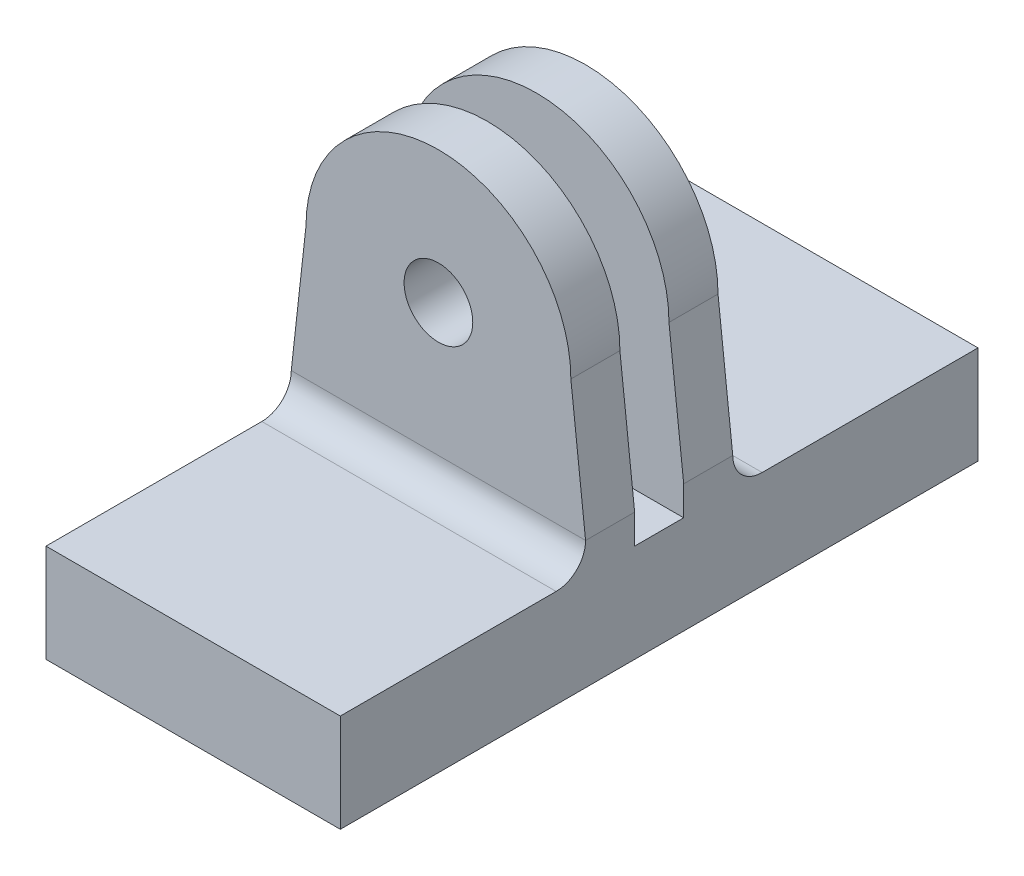
ISO-10303-21;
HEADER;
FILE_DESCRIPTION(('STEP AP214'),'2;1');
FILE_NAME('part.step','',(''),(''),'','','');
FILE_SCHEMA(('AUTOMOTIVE_DESIGN { 1 0 10303 214 1 1 1 1 }'));
ENDSEC;
DATA;
#1=APPLICATION_CONTEXT('core data for automotive mechanical design processes');
#2=APPLICATION_PROTOCOL_DEFINITION('international standard','automotive_design',2000,#1);
#3=PRODUCT_CONTEXT('',#1,'mechanical');
#4=PRODUCT('Part','Part','',(#3));
#5=PRODUCT_RELATED_PRODUCT_CATEGORY('part','',(#4));
#6=PRODUCT_DEFINITION_FORMATION('','',#4);
#7=PRODUCT_DEFINITION_CONTEXT('part definition',#1,'design');
#8=PRODUCT_DEFINITION('design','',#6,#7);
#9=PRODUCT_DEFINITION_SHAPE('','',#8);
#10=(LENGTH_UNIT() NAMED_UNIT(*) SI_UNIT(.MILLI.,.METRE.));
#11=(NAMED_UNIT(*) PLANE_ANGLE_UNIT() SI_UNIT($,.RADIAN.));
#12=(NAMED_UNIT(*) SI_UNIT($,.STERADIAN.) SOLID_ANGLE_UNIT());
#13=UNCERTAINTY_MEASURE_WITH_UNIT(LENGTH_MEASURE(1.E-05),#10,'distance_accuracy_value','');
#14=(GEOMETRIC_REPRESENTATION_CONTEXT(3) GLOBAL_UNCERTAINTY_ASSIGNED_CONTEXT((#13)) GLOBAL_UNIT_ASSIGNED_CONTEXT((#10,
#11,#12)) REPRESENTATION_CONTEXT('',''));
#15=CARTESIAN_POINT('',(0.,0.,0.));
#16=DIRECTION('',(0.,0.,1.));
#17=DIRECTION('',(1.,0.,0.));
#18=AXIS2_PLACEMENT_3D('',#15,#16,#17);
#19=CARTESIAN_POINT('',(0.,10.,0.));
#20=DIRECTION('',(0.,-1.,0.));
#21=DIRECTION('',(0.,0.,-1.));
#22=AXIS2_PLACEMENT_3D('',#19,#20,#21);
#23=PLANE('',#22);
#24=DIRECTION('',(1.,0.,0.));
#25=VECTOR('',#24,1.);
#26=CARTESIAN_POINT('',(-31.04834939252,10.,-43.));
#27=LINE('',#26,#25);
#28=CARTESIAN_POINT('',(0.,10.,-43.));
#29=VERTEX_POINT('',#28);
#30=CARTESIAN_POINT('',(30.,10.,-43.));
#31=VERTEX_POINT('',#30);
#32=EDGE_CURVE('E63',#29,#31,#27,.T.);
#33=ORIENTED_EDGE('',*,*,#32,.T.);
#34=DIRECTION('',(0.,0.,-1.));
#35=VECTOR('',#34,1.);
#36=CARTESIAN_POINT('',(30.,10.,0.));
#37=LINE('',#36,#35);
#38=CARTESIAN_POINT('',(30.,10.,-65.));
#39=VERTEX_POINT('',#38);
#40=EDGE_CURVE('E224',#31,#39,#37,.T.);
#41=ORIENTED_EDGE('',*,*,#40,.T.);
#42=DIRECTION('',(-1.,0.,0.));
#43=VECTOR('',#42,1.);
#44=CARTESIAN_POINT('',(0.,10.,-65.));
#45=LINE('',#44,#43);
#46=CARTESIAN_POINT('',(0.,10.,-65.));
#47=VERTEX_POINT('',#46);
#48=EDGE_CURVE('E227',#39,#47,#45,.T.);
#49=ORIENTED_EDGE('',*,*,#48,.T.);
#50=DIRECTION('',(0.,0.,1.));
#51=VECTOR('',#50,1.);
#52=CARTESIAN_POINT('',(0.,10.,0.));
#53=LINE('',#52,#51);
#54=EDGE_CURVE('E218',#47,#29,#53,.T.);
#55=ORIENTED_EDGE('',*,*,#54,.T.);
#56=EDGE_LOOP('',(#33,#41,#49,#55));
#57=FACE_BOUND('',#56,.T.);
#58=ADVANCED_FACE('F40',(#57),#23,.F.);
#59=CARTESIAN_POINT('',(30.,10.,0.));
#60=VERTEX_POINT('',#59);
#61=CARTESIAN_POINT('',(30.,10.,-22.));
#62=VERTEX_POINT('',#61);
#63=EDGE_CURVE('E225',#60,#62,#37,.T.);
#64=ORIENTED_EDGE('',*,*,#63,.T.);
#65=DIRECTION('',(1.,0.,0.));
#66=VECTOR('',#65,1.);
#67=CARTESIAN_POINT('',(-31.04834939252,10.,-22.));
#68=LINE('',#67,#66);
#69=CARTESIAN_POINT('',(0.,10.,-22.));
#70=VERTEX_POINT('',#69);
#71=EDGE_CURVE('E203',#70,#62,#68,.T.);
#72=ORIENTED_EDGE('',*,*,#71,.F.);
#73=CARTESIAN_POINT('',(0.,10.,0.));
#74=VERTEX_POINT('',#73);
#75=EDGE_CURVE('E222',#70,#74,#53,.T.);
#76=ORIENTED_EDGE('',*,*,#75,.T.);
#77=DIRECTION('',(1.,0.,0.));
#78=VECTOR('',#77,1.);
#79=CARTESIAN_POINT('',(0.,10.,0.));
#80=LINE('',#79,#78);
#81=EDGE_CURVE('E220',#74,#60,#80,.T.);
#82=ORIENTED_EDGE('',*,*,#81,.T.);
#83=EDGE_LOOP('',(#64,#72,#76,#82));
#84=FACE_BOUND('',#83,.T.);
#85=ADVANCED_FACE('F333',(#84),#23,.F.);
#86=CARTESIAN_POINT('',(0.,10.,0.));
#87=DIRECTION('',(1.,0.,0.));
#88=DIRECTION('',(0.,0.,-1.));
#89=AXIS2_PLACEMENT_3D('',#86,#87,#88);
#90=PLANE('',#89);
#91=CARTESIAN_POINT('',(0.,13.,-22.));
#92=DIRECTION('',(1.,0.,0.));
#93=DIRECTION('',(0.,0.,-1.));
#94=AXIS2_PLACEMENT_3D('',#91,#92,#93);
#95=CIRCLE('',#94,3.);
#96=CARTESIAN_POINT('',(0.,13.,-25.));
#97=VERTEX_POINT('',#96);
#98=EDGE_CURVE('E200',#70,#97,#95,.T.);
#99=ORIENTED_EDGE('',*,*,#98,.T.);
#100=DIRECTION('',(0.,0.,-1.));
#101=VECTOR('',#100,1.);
#102=CARTESIAN_POINT('',(0.,13.,0.));
#103=LINE('',#102,#101);
#104=CARTESIAN_POINT('',(0.,13.,-30.));
#105=VERTEX_POINT('',#104);
#106=EDGE_CURVE('E173',#97,#105,#103,.T.);
#107=ORIENTED_EDGE('',*,*,#106,.T.);
#108=DIRECTION('',(0.,-1.,0.));
#109=VECTOR('',#108,1.);
#110=CARTESIAN_POINT('',(0.,10.,-30.));
#111=LINE('',#110,#109);
#112=CARTESIAN_POINT('',(0.,10.,-30.));
#113=VERTEX_POINT('',#112);
#114=EDGE_CURVE('E202',#105,#113,#111,.T.);
#115=ORIENTED_EDGE('',*,*,#114,.T.);
#116=CARTESIAN_POINT('',(0.,10.,-35.));
#117=VERTEX_POINT('',#116);
#118=EDGE_CURVE('E221',#117,#113,#53,.T.);
#119=ORIENTED_EDGE('',*,*,#118,.F.);
#120=DIRECTION('',(0.,1.,0.));
#121=VECTOR('',#120,1.);
#122=CARTESIAN_POINT('',(0.,10.,-35.));
#123=LINE('',#122,#121);
#124=CARTESIAN_POINT('',(0.,13.,-35.));
#125=VERTEX_POINT('',#124);
#126=EDGE_CURVE('E172',#117,#125,#123,.T.);
#127=ORIENTED_EDGE('',*,*,#126,.T.);
#128=CARTESIAN_POINT('',(0.,13.,-40.));
#129=VERTEX_POINT('',#128);
#130=EDGE_CURVE('E155',#125,#129,#103,.T.);
#131=ORIENTED_EDGE('',*,*,#130,.T.);
#132=CARTESIAN_POINT('',(0.,13.,-43.));
#133=DIRECTION('',(1.,0.,0.));
#134=DIRECTION('',(0.,0.,-1.));
#135=AXIS2_PLACEMENT_3D('',#132,#133,#134);
#136=CIRCLE('',#135,3.);
#137=EDGE_CURVE('E170',#129,#29,#136,.T.);
#138=ORIENTED_EDGE('',*,*,#137,.T.);
#139=ORIENTED_EDGE('',*,*,#54,.F.);
#140=DIRECTION('',(0.,-1.,0.));
#141=VECTOR('',#140,1.);
#142=CARTESIAN_POINT('',(0.,10.,-65.));
#143=LINE('',#142,#141);
#144=CARTESIAN_POINT('',(0.,0.,-65.));
#145=VERTEX_POINT('',#144);
#146=EDGE_CURVE('E230',#47,#145,#143,.T.);
#147=ORIENTED_EDGE('',*,*,#146,.T.);
#148=DIRECTION('',(0.,0.,1.));
#149=VECTOR('',#148,1.);
#150=CARTESIAN_POINT('',(0.,0.,0.));
#151=LINE('',#150,#149);
#152=CARTESIAN_POINT('',(0.,0.,0.));
#153=VERTEX_POINT('',#152);
#154=EDGE_CURVE('E217',#145,#153,#151,.T.);
#155=ORIENTED_EDGE('',*,*,#154,.T.);
#156=DIRECTION('',(0.,-1.,0.));
#157=VECTOR('',#156,1.);
#158=CARTESIAN_POINT('',(0.,10.,0.));
#159=LINE('',#158,#157);
#160=EDGE_CURVE('E48',#74,#153,#159,.T.);
#161=ORIENTED_EDGE('',*,*,#160,.F.);
#162=ORIENTED_EDGE('',*,*,#75,.F.);
#163=EDGE_LOOP('',(#99,#107,#115,#119,#127,#131,#138,#139,#147,#155,#161,#162));
#164=FACE_BOUND('',#163,.T.);
#165=ADVANCED_FACE('F42',(#164),#90,.F.);
#166=CARTESIAN_POINT('',(0.,10.,0.));
#167=DIRECTION('',(0.,0.,-1.));
#168=DIRECTION('',(-1.,0.,0.));
#169=AXIS2_PLACEMENT_3D('',#166,#167,#168);
#170=PLANE('',#169);
#171=DIRECTION('',(1.,0.,0.));
#172=VECTOR('',#171,1.);
#173=CARTESIAN_POINT('',(0.,0.,0.));
#174=LINE('',#173,#172);
#175=CARTESIAN_POINT('',(30.,0.,0.));
#176=VERTEX_POINT('',#175);
#177=EDGE_CURVE('E233',#153,#176,#174,.T.);
#178=ORIENTED_EDGE('',*,*,#177,.T.);
#179=DIRECTION('',(0.,-1.,0.));
#180=VECTOR('',#179,1.);
#181=CARTESIAN_POINT('',(30.,10.,0.));
#182=LINE('',#181,#180);
#183=EDGE_CURVE('E244',#60,#176,#182,.T.);
#184=ORIENTED_EDGE('',*,*,#183,.F.);
#185=ORIENTED_EDGE('',*,*,#81,.F.);
#186=ORIENTED_EDGE('',*,*,#160,.T.);
#187=EDGE_LOOP('',(#178,#184,#185,#186));
#188=FACE_BOUND('',#187,.T.);
#189=ADVANCED_FACE('F250',(#188),#170,.F.);
#190=CARTESIAN_POINT('',(30.,10.,0.));
#191=DIRECTION('',(-1.,0.,0.));
#192=DIRECTION('',(0.,0.,1.));
#193=AXIS2_PLACEMENT_3D('',#190,#191,#192);
#194=PLANE('',#193);
#195=CARTESIAN_POINT('',(30.,13.,-43.));
#196=DIRECTION('',(-1.,0.,0.));
#197=DIRECTION('',(0.,0.,1.));
#198=AXIS2_PLACEMENT_3D('',#195,#196,#197);
#199=CIRCLE('',#198,3.);
#200=CARTESIAN_POINT('',(30.,13.,-40.));
#201=VERTEX_POINT('',#200);
#202=EDGE_CURVE('E189',#31,#201,#199,.T.);
#203=ORIENTED_EDGE('',*,*,#202,.T.);
#204=DIRECTION('',(0.,0.,-1.));
#205=VECTOR('',#204,1.);
#206=CARTESIAN_POINT('',(30.,13.,0.));
#207=LINE('',#206,#205);
#208=CARTESIAN_POINT('',(30.,13.,-35.));
#209=VERTEX_POINT('',#208);
#210=EDGE_CURVE('E295',#209,#201,#207,.T.);
#211=ORIENTED_EDGE('',*,*,#210,.F.);
#212=DIRECTION('',(0.,-1.,0.));
#213=VECTOR('',#212,1.);
#214=CARTESIAN_POINT('',(30.,10.,-35.));
#215=LINE('',#214,#213);
#216=CARTESIAN_POINT('',(30.,10.,-35.));
#217=VERTEX_POINT('',#216);
#218=EDGE_CURVE('E186',#209,#217,#215,.T.);
#219=ORIENTED_EDGE('',*,*,#218,.T.);
#220=CARTESIAN_POINT('',(30.,10.,-30.));
#221=VERTEX_POINT('',#220);
#222=EDGE_CURVE('E228',#221,#217,#37,.T.);
#223=ORIENTED_EDGE('',*,*,#222,.F.);
#224=DIRECTION('',(0.,1.,0.));
#225=VECTOR('',#224,1.);
#226=CARTESIAN_POINT('',(30.,10.,-30.));
#227=LINE('',#226,#225);
#228=CARTESIAN_POINT('',(30.,13.,-30.));
#229=VERTEX_POINT('',#228);
#230=EDGE_CURVE('E197',#221,#229,#227,.T.);
#231=ORIENTED_EDGE('',*,*,#230,.T.);
#232=CARTESIAN_POINT('',(30.,13.,-25.));
#233=VERTEX_POINT('',#232);
#234=EDGE_CURVE('E55',#233,#229,#207,.T.);
#235=ORIENTED_EDGE('',*,*,#234,.F.);
#236=CARTESIAN_POINT('',(30.,13.,-22.));
#237=DIRECTION('',(-1.,0.,0.));
#238=DIRECTION('',(0.,0.,-1.));
#239=AXIS2_PLACEMENT_3D('',#236,#237,#238);
#240=CIRCLE('',#239,3.);
#241=EDGE_CURVE('E206',#233,#62,#240,.T.);
#242=ORIENTED_EDGE('',*,*,#241,.T.);
#243=ORIENTED_EDGE('',*,*,#63,.F.);
#244=ORIENTED_EDGE('',*,*,#183,.T.);
#245=DIRECTION('',(0.,0.,-1.));
#246=VECTOR('',#245,1.);
#247=CARTESIAN_POINT('',(30.,0.,0.));
#248=LINE('',#247,#246);
#249=CARTESIAN_POINT('',(30.,0.,-65.));
#250=VERTEX_POINT('',#249);
#251=EDGE_CURVE('E235',#176,#250,#248,.T.);
#252=ORIENTED_EDGE('',*,*,#251,.T.);
#253=DIRECTION('',(0.,-1.,0.));
#254=VECTOR('',#253,1.);
#255=CARTESIAN_POINT('',(30.,10.,-65.));
#256=LINE('',#255,#254);
#257=EDGE_CURVE('E241',#39,#250,#256,.T.);
#258=ORIENTED_EDGE('',*,*,#257,.F.);
#259=ORIENTED_EDGE('',*,*,#40,.F.);
#260=EDGE_LOOP('',(#203,#211,#219,#223,#231,#235,#242,#243,#244,#252,#258,#259));
#261=FACE_BOUND('',#260,.T.);
#262=ADVANCED_FACE('F260',(#261),#194,.F.);
#263=CARTESIAN_POINT('',(0.,10.,-65.));
#264=DIRECTION('',(0.,0.,1.));
#265=DIRECTION('',(1.,0.,0.));
#266=AXIS2_PLACEMENT_3D('',#263,#264,#265);
#267=PLANE('',#266);
#268=DIRECTION('',(-1.,0.,0.));
#269=VECTOR('',#268,1.);
#270=CARTESIAN_POINT('',(0.,0.,-65.));
#271=LINE('',#270,#269);
#272=EDGE_CURVE('E237',#250,#145,#271,.T.);
#273=ORIENTED_EDGE('',*,*,#272,.T.);
#274=ORIENTED_EDGE('',*,*,#146,.F.);
#275=ORIENTED_EDGE('',*,*,#48,.F.);
#276=ORIENTED_EDGE('',*,*,#257,.T.);
#277=EDGE_LOOP('',(#273,#274,#275,#276));
#278=FACE_BOUND('',#277,.T.);
#279=ADVANCED_FACE('F264',(#278),#267,.F.);
#280=ORIENTED_EDGE('',*,*,#222,.T.);
#281=DIRECTION('',(1.,0.,0.));
#282=VECTOR('',#281,1.);
#283=CARTESIAN_POINT('',(-31.04834939252,10.,-35.));
#284=LINE('',#283,#282);
#285=EDGE_CURVE('E187',#117,#217,#284,.T.);
#286=ORIENTED_EDGE('',*,*,#285,.F.);
#287=ORIENTED_EDGE('',*,*,#118,.T.);
#288=DIRECTION('',(1.,0.,0.));
#289=VECTOR('',#288,1.);
#290=CARTESIAN_POINT('',(-31.04834939252,10.,-30.));
#291=LINE('',#290,#289);
#292=EDGE_CURVE('E209',#113,#221,#291,.T.);
#293=ORIENTED_EDGE('',*,*,#292,.T.);
#294=EDGE_LOOP('',(#280,#286,#287,#293));
#295=FACE_BOUND('',#294,.T.);
#296=ADVANCED_FACE('F269',(#295),#23,.F.);
#297=CARTESIAN_POINT('',(0.,0.,0.));
#298=DIRECTION('',(0.,-1.,0.));
#299=DIRECTION('',(0.,0.,-1.));
#300=AXIS2_PLACEMENT_3D('',#297,#298,#299);
#301=PLANE('',#300);
#302=ORIENTED_EDGE('',*,*,#154,.F.);
#303=ORIENTED_EDGE('',*,*,#272,.F.);
#304=ORIENTED_EDGE('',*,*,#251,.F.);
#305=ORIENTED_EDGE('',*,*,#177,.F.);
#306=EDGE_LOOP('',(#302,#303,#304,#305));
#307=FACE_BOUND('',#306,.T.);
#308=ADVANCED_FACE('F256',(#307),#301,.T.);
#309=CARTESIAN_POINT('',(-31.04834939252,13.,-22.));
#310=DIRECTION('',(1.,0.,0.));
#311=DIRECTION('',(0.,0.,-1.));
#312=AXIS2_PLACEMENT_3D('',#309,#310,#311);
#313=CYLINDRICAL_SURFACE('',#312,3.);
#314=ORIENTED_EDGE('',*,*,#98,.F.);
#315=ORIENTED_EDGE('',*,*,#71,.T.);
#316=ORIENTED_EDGE('',*,*,#241,.F.);
#317=DIRECTION('',(1.,0.,0.));
#318=VECTOR('',#317,1.);
#319=CARTESIAN_POINT('',(-31.04834939252,13.,-25.));
#320=LINE('',#319,#318);
#321=EDGE_CURVE('E212',#97,#233,#320,.T.);
#322=ORIENTED_EDGE('',*,*,#321,.F.);
#323=EDGE_LOOP('',(#314,#315,#316,#322));
#324=FACE_BOUND('',#323,.T.);
#325=ADVANCED_FACE('F346',(#324),#313,.F.);
#326=CARTESIAN_POINT('',(-31.04834939252,40.,-25.));
#327=DIRECTION('',(0.,0.,1.));
#328=DIRECTION('',(1.,0.,0.));
#329=AXIS2_PLACEMENT_3D('',#326,#327,#328);
#330=PLANE('',#329);
#331=CARTESIAN_POINT('',(15.,26.5,-25.));
#332=DIRECTION('',(0.,0.,1.));
#333=DIRECTION('',(1.,0.,0.));
#334=AXIS2_PLACEMENT_3D('',#331,#332,#333);
#335=CIRCLE('',#334,3.5);
#336=CARTESIAN_POINT('',(18.5,26.5,-25.));
#337=VERTEX_POINT('',#336);
#338=EDGE_CURVE('E162',#337,#337,#335,.T.);
#339=ORIENTED_EDGE('',*,*,#338,.F.);
#340=EDGE_LOOP('',(#339));
#341=FACE_BOUND('',#340,.T.);
#342=DIRECTION('',(0.110431526074847,0.993883734673619,0.));
#343=VECTOR('',#342,1.);
#344=CARTESIAN_POINT('',(2.5847762269205,36.2629860422844,-25.));
#345=LINE('',#344,#343);
#346=CARTESIAN_POINT('',(1.50000000000001,26.5,-25.));
#347=VERTEX_POINT('',#346);
#348=EDGE_CURVE('E181',#97,#347,#345,.T.);
#349=ORIENTED_EDGE('',*,*,#348,.F.);
#350=ORIENTED_EDGE('',*,*,#321,.T.);
#351=DIRECTION('',(0.110431526074847,-0.993883734673619,0.));
#352=VECTOR('',#351,1.);
#353=CARTESIAN_POINT('',(26.2920933000912,46.3711602991791,-25.));
#354=LINE('',#353,#352);
#355=CARTESIAN_POINT('',(28.5,26.5,-25.));
#356=VERTEX_POINT('',#355);
#357=EDGE_CURVE('E288',#356,#233,#354,.T.);
#358=ORIENTED_EDGE('',*,*,#357,.F.);
#359=CARTESIAN_POINT('',(15.,26.5,-25.));
#360=DIRECTION('',(0.,0.,1.));
#361=DIRECTION('',(1.,0.,0.));
#362=AXIS2_PLACEMENT_3D('',#359,#360,#361);
#363=CIRCLE('',#362,13.5);
#364=EDGE_CURVE('E281',#347,#356,#363,.F.);
#365=ORIENTED_EDGE('',*,*,#364,.F.);
#366=EDGE_LOOP('',(#349,#350,#358,#365));
#367=FACE_BOUND('',#366,.T.);
#368=ADVANCED_FACE('F420',(#341,#367),#330,.T.);
#369=CARTESIAN_POINT('',(-31.04834939252,10.,-30.));
#370=DIRECTION('',(0.,0.,-1.));
#371=DIRECTION('',(-1.,0.,0.));
#372=AXIS2_PLACEMENT_3D('',#369,#370,#371);
#373=PLANE('',#372);
#374=CARTESIAN_POINT('',(15.,26.5,-30.));
#375=DIRECTION('',(0.,0.,-1.));
#376=DIRECTION('',(-1.,0.,0.));
#377=AXIS2_PLACEMENT_3D('',#374,#375,#376);
#378=CIRCLE('',#377,3.5);
#379=CARTESIAN_POINT('',(11.5,26.5,-30.));
#380=VERTEX_POINT('',#379);
#381=EDGE_CURVE('E305',#380,#380,#378,.T.);
#382=ORIENTED_EDGE('',*,*,#381,.F.);
#383=EDGE_LOOP('',(#382));
#384=FACE_BOUND('',#383,.T.);
#385=DIRECTION('',(-0.110431526074847,-0.993883734673619,0.));
#386=VECTOR('',#385,1.);
#387=CARTESIAN_POINT('',(-0.707906699908788,6.62883970082095,-30.));
#388=LINE('',#387,#386);
#389=CARTESIAN_POINT('',(1.50000000000001,26.5,-30.));
#390=VERTEX_POINT('',#389);
#391=EDGE_CURVE('E280',#390,#105,#388,.T.);
#392=ORIENTED_EDGE('',*,*,#391,.F.);
#393=CARTESIAN_POINT('',(15.,26.5,-30.));
#394=DIRECTION('',(0.,0.,-1.));
#395=DIRECTION('',(-1.,0.,0.));
#396=AXIS2_PLACEMENT_3D('',#393,#394,#395);
#397=CIRCLE('',#396,13.5);
#398=CARTESIAN_POINT('',(28.5,26.5,-30.));
#399=VERTEX_POINT('',#398);
#400=EDGE_CURVE('E283',#399,#390,#397,.F.);
#401=ORIENTED_EDGE('',*,*,#400,.F.);
#402=DIRECTION('',(-0.110431526074847,0.993883734673619,0.));
#403=VECTOR('',#402,1.);
#404=CARTESIAN_POINT('',(29.5847762269205,16.7370139577157,-30.));
#405=LINE('',#404,#403);
#406=EDGE_CURVE('E290',#229,#399,#405,.T.);
#407=ORIENTED_EDGE('',*,*,#406,.F.);
#408=ORIENTED_EDGE('',*,*,#230,.F.);
#409=ORIENTED_EDGE('',*,*,#292,.F.);
#410=ORIENTED_EDGE('',*,*,#114,.F.);
#411=EDGE_LOOP('',(#392,#401,#407,#408,#409,#410));
#412=FACE_BOUND('',#411,.T.);
#413=ADVANCED_FACE('F432',(#384,#412),#373,.T.);
#414=CARTESIAN_POINT('',(-31.04834939252,13.,-43.));
#415=DIRECTION('',(1.,0.,0.));
#416=DIRECTION('',(0.,0.,-1.));
#417=AXIS2_PLACEMENT_3D('',#414,#415,#416);
#418=CYLINDRICAL_SURFACE('',#417,3.);
#419=ORIENTED_EDGE('',*,*,#137,.F.);
#420=DIRECTION('',(1.,0.,0.));
#421=VECTOR('',#420,1.);
#422=CARTESIAN_POINT('',(-31.04834939252,13.,-40.));
#423=LINE('',#422,#421);
#424=EDGE_CURVE('E179',#129,#201,#423,.T.);
#425=ORIENTED_EDGE('',*,*,#424,.T.);
#426=ORIENTED_EDGE('',*,*,#202,.F.);
#427=ORIENTED_EDGE('',*,*,#32,.F.);
#428=EDGE_LOOP('',(#419,#425,#426,#427));
#429=FACE_BOUND('',#428,.T.);
#430=ADVANCED_FACE('F177',(#429),#418,.F.);
#431=CARTESIAN_POINT('',(-31.04834939252,10.,-35.));
#432=DIRECTION('',(0.,0.,1.));
#433=DIRECTION('',(1.,0.,0.));
#434=AXIS2_PLACEMENT_3D('',#431,#432,#433);
#435=PLANE('',#434);
#436=CARTESIAN_POINT('',(15.,26.5,-35.));
#437=DIRECTION('',(0.,0.,1.));
#438=DIRECTION('',(1.,0.,0.));
#439=AXIS2_PLACEMENT_3D('',#436,#437,#438);
#440=CIRCLE('',#439,3.5);
#441=CARTESIAN_POINT('',(18.5,26.5,-35.));
#442=VERTEX_POINT('',#441);
#443=EDGE_CURVE('E308',#442,#442,#440,.T.);
#444=ORIENTED_EDGE('',*,*,#443,.F.);
#445=EDGE_LOOP('',(#444));
#446=FACE_BOUND('',#445,.T.);
#447=DIRECTION('',(0.110431526074847,0.993883734673619,0.));
#448=VECTOR('',#447,1.);
#449=CARTESIAN_POINT('',(-0.707906699908788,6.62883970082095,-35.));
#450=LINE('',#449,#448);
#451=CARTESIAN_POINT('',(1.50000000000001,26.5,-35.));
#452=VERTEX_POINT('',#451);
#453=EDGE_CURVE('E278',#125,#452,#450,.T.);
#454=ORIENTED_EDGE('',*,*,#453,.F.);
#455=ORIENTED_EDGE('',*,*,#126,.F.);
#456=ORIENTED_EDGE('',*,*,#285,.T.);
#457=ORIENTED_EDGE('',*,*,#218,.F.);
#458=DIRECTION('',(0.110431526074847,-0.993883734673619,0.));
#459=VECTOR('',#458,1.);
#460=CARTESIAN_POINT('',(29.5847762269205,16.7370139577157,-35.));
#461=LINE('',#460,#459);
#462=CARTESIAN_POINT('',(28.5,26.5,-35.));
#463=VERTEX_POINT('',#462);
#464=EDGE_CURVE('E292',#463,#209,#461,.T.);
#465=ORIENTED_EDGE('',*,*,#464,.F.);
#466=CARTESIAN_POINT('',(15.,26.5,-35.));
#467=DIRECTION('',(0.,0.,1.));
#468=DIRECTION('',(1.,0.,0.));
#469=AXIS2_PLACEMENT_3D('',#466,#467,#468);
#470=CIRCLE('',#469,13.5);
#471=EDGE_CURVE('E279',#452,#463,#470,.F.);
#472=ORIENTED_EDGE('',*,*,#471,.F.);
#473=EDGE_LOOP('',(#454,#455,#456,#457,#465,#472));
#474=FACE_BOUND('',#473,.T.);
#475=ADVANCED_FACE('F275',(#446,#474),#435,.T.);
#476=CARTESIAN_POINT('',(-31.04834939252,40.,-40.));
#477=DIRECTION('',(0.,0.,-1.));
#478=DIRECTION('',(-1.,0.,0.));
#479=AXIS2_PLACEMENT_3D('',#476,#477,#478);
#480=PLANE('',#479);
#481=CARTESIAN_POINT('',(15.,26.5,-40.));
#482=DIRECTION('',(0.,0.,-1.));
#483=DIRECTION('',(-1.,0.,0.));
#484=AXIS2_PLACEMENT_3D('',#481,#482,#483);
#485=CIRCLE('',#484,3.5);
#486=CARTESIAN_POINT('',(11.5,26.5,-40.));
#487=VERTEX_POINT('',#486);
#488=EDGE_CURVE('E311',#487,#487,#485,.T.);
#489=ORIENTED_EDGE('',*,*,#488,.F.);
#490=EDGE_LOOP('',(#489));
#491=FACE_BOUND('',#490,.T.);
#492=DIRECTION('',(-0.110431526074847,-0.993883734673619,0.));
#493=VECTOR('',#492,1.);
#494=CARTESIAN_POINT('',(1.50000000000001,26.5,-40.));
#495=LINE('',#494,#493);
#496=CARTESIAN_POINT('',(1.50000000000001,26.5,-40.));
#497=VERTEX_POINT('',#496);
#498=EDGE_CURVE('E152',#497,#129,#495,.T.);
#499=ORIENTED_EDGE('',*,*,#498,.F.);
#500=CARTESIAN_POINT('',(15.,26.5,-40.));
#501=DIRECTION('',(0.,0.,-1.));
#502=DIRECTION('',(-1.,0.,0.));
#503=AXIS2_PLACEMENT_3D('',#500,#501,#502);
#504=CIRCLE('',#503,13.5);
#505=CARTESIAN_POINT('',(28.5,26.5,-40.));
#506=VERTEX_POINT('',#505);
#507=EDGE_CURVE('E11',#506,#497,#504,.F.);
#508=ORIENTED_EDGE('',*,*,#507,.F.);
#509=DIRECTION('',(-0.110431526074847,0.993883734673619,0.));
#510=VECTOR('',#509,1.);
#511=CARTESIAN_POINT('',(28.5,26.5,-40.));
#512=LINE('',#511,#510);
#513=EDGE_CURVE('E161',#201,#506,#512,.T.);
#514=ORIENTED_EDGE('',*,*,#513,.F.);
#515=ORIENTED_EDGE('',*,*,#424,.F.);
#516=EDGE_LOOP('',(#499,#508,#514,#515));
#517=FACE_BOUND('',#516,.T.);
#518=ADVANCED_FACE('F184',(#491,#517),#480,.T.);
#519=CARTESIAN_POINT('',(28.5,26.5,0.));
#520=DIRECTION('',(-0.993883734673619,-0.110431526074847,0.));
#521=DIRECTION('',(0.110431526074847,-0.993883734673619,0.));
#522=AXIS2_PLACEMENT_3D('',#519,#520,#521);
#523=PLANE('',#522);
#524=ORIENTED_EDGE('',*,*,#464,.T.);
#525=ORIENTED_EDGE('',*,*,#210,.T.);
#526=ORIENTED_EDGE('',*,*,#513,.T.);
#527=DIRECTION('',(0.,0.,-1.));
#528=VECTOR('',#527,1.);
#529=CARTESIAN_POINT('',(28.5,26.5,0.));
#530=LINE('',#529,#528);
#531=EDGE_CURVE('E297',#463,#506,#530,.T.);
#532=ORIENTED_EDGE('',*,*,#531,.F.);
#533=EDGE_LOOP('',(#524,#525,#526,#532));
#534=FACE_BOUND('',#533,.T.);
#535=ADVANCED_FACE('F318',(#534),#523,.F.);
#536=CARTESIAN_POINT('',(15.,26.5,0.));
#537=DIRECTION('',(0.,0.,-1.));
#538=DIRECTION('',(-1.,0.,0.));
#539=AXIS2_PLACEMENT_3D('',#536,#537,#538);
#540=CYLINDRICAL_SURFACE('',#539,13.5);
#541=ORIENTED_EDGE('',*,*,#471,.T.);
#542=ORIENTED_EDGE('',*,*,#531,.T.);
#543=ORIENTED_EDGE('',*,*,#507,.T.);
#544=DIRECTION('',(0.,0.,-1.));
#545=VECTOR('',#544,1.);
#546=CARTESIAN_POINT('',(1.50000000000001,26.5,0.));
#547=LINE('',#546,#545);
#548=EDGE_CURVE('E158',#452,#497,#547,.T.);
#549=ORIENTED_EDGE('',*,*,#548,.F.);
#550=EDGE_LOOP('',(#541,#542,#543,#549));
#551=FACE_BOUND('',#550,.T.);
#552=ADVANCED_FACE('F325',(#551),#540,.T.);
#553=CARTESIAN_POINT('',(1.50000000000001,26.5,0.));
#554=DIRECTION('',(0.993883734673619,-0.110431526074847,0.));
#555=DIRECTION('',(0.110431526074847,0.993883734673619,0.));
#556=AXIS2_PLACEMENT_3D('',#553,#554,#555);
#557=PLANE('',#556);
#558=ORIENTED_EDGE('',*,*,#453,.T.);
#559=ORIENTED_EDGE('',*,*,#548,.T.);
#560=ORIENTED_EDGE('',*,*,#498,.T.);
#561=ORIENTED_EDGE('',*,*,#130,.F.);
#562=EDGE_LOOP('',(#558,#559,#560,#561));
#563=FACE_BOUND('',#562,.T.);
#564=ADVANCED_FACE('F154',(#563),#557,.F.);
#565=ORIENTED_EDGE('',*,*,#348,.T.);
#566=EDGE_CURVE('E293',#347,#390,#547,.T.);
#567=ORIENTED_EDGE('',*,*,#566,.T.);
#568=ORIENTED_EDGE('',*,*,#391,.T.);
#569=ORIENTED_EDGE('',*,*,#106,.F.);
#570=EDGE_LOOP('',(#565,#567,#568,#569));
#571=FACE_BOUND('',#570,.T.);
#572=ADVANCED_FACE('F490',(#571),#557,.F.);
#573=ORIENTED_EDGE('',*,*,#364,.T.);
#574=EDGE_CURVE('E300',#356,#399,#530,.T.);
#575=ORIENTED_EDGE('',*,*,#574,.T.);
#576=ORIENTED_EDGE('',*,*,#400,.T.);
#577=ORIENTED_EDGE('',*,*,#566,.F.);
#578=EDGE_LOOP('',(#573,#575,#576,#577));
#579=FACE_BOUND('',#578,.T.);
#580=ADVANCED_FACE('F481',(#579),#540,.T.);
#581=ORIENTED_EDGE('',*,*,#357,.T.);
#582=ORIENTED_EDGE('',*,*,#234,.T.);
#583=ORIENTED_EDGE('',*,*,#406,.T.);
#584=ORIENTED_EDGE('',*,*,#574,.F.);
#585=EDGE_LOOP('',(#581,#582,#583,#584));
#586=FACE_BOUND('',#585,.T.);
#587=ADVANCED_FACE('F328',(#586),#523,.F.);
#588=CARTESIAN_POINT('',(15.,26.5,0.));
#589=DIRECTION('',(0.,0.,-1.));
#590=DIRECTION('',(-1.,0.,0.));
#591=AXIS2_PLACEMENT_3D('',#588,#589,#590);
#592=CYLINDRICAL_SURFACE('',#591,3.5);
#593=ORIENTED_EDGE('',*,*,#443,.T.);
#594=EDGE_LOOP('',(#593));
#595=FACE_BOUND('',#594,.T.);
#596=ORIENTED_EDGE('',*,*,#488,.T.);
#597=EDGE_LOOP('',(#596));
#598=FACE_BOUND('',#597,.T.);
#599=ADVANCED_FACE('F315',(#595,#598),#592,.F.);
#600=ORIENTED_EDGE('',*,*,#338,.T.);
#601=EDGE_LOOP('',(#600));
#602=FACE_BOUND('',#601,.T.);
#603=ORIENTED_EDGE('',*,*,#381,.T.);
#604=EDGE_LOOP('',(#603));
#605=FACE_BOUND('',#604,.T.);
#606=ADVANCED_FACE('F525',(#602,#605),#592,.F.);
#607=CLOSED_SHELL('',(#58,#85,#165,#189,#262,#279,#296,#308,#325,#368,#413,#430,#475,#518,#535,
#552,#564,#572,#580,#587,#599,#606));
#608=MANIFOLD_SOLID_BREP('B2',#607);
#609=ADVANCED_BREP_SHAPE_REPRESENTATION('',(#18,#608),#14);
#610=SHAPE_DEFINITION_REPRESENTATION(#9,#609);
ENDSEC;
END-ISO-10303-21;
